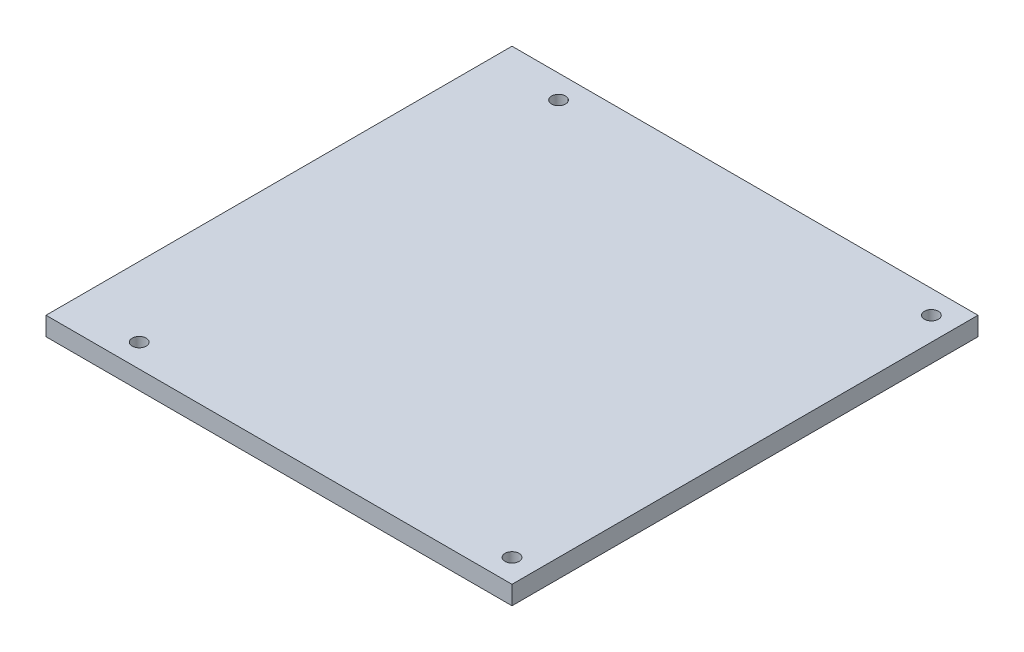
ISO-10303-21;
HEADER;
FILE_DESCRIPTION(('STEP AP214'),'2;1');
FILE_NAME('part.step','',(''),(''),'','','');
FILE_SCHEMA(('AUTOMOTIVE_DESIGN { 1 0 10303 214 1 1 1 1 }'));
ENDSEC;
DATA;
#1=APPLICATION_CONTEXT('core data for automotive mechanical design processes');
#2=APPLICATION_PROTOCOL_DEFINITION('international standard','automotive_design',2000,#1);
#3=PRODUCT_CONTEXT('',#1,'mechanical');
#4=PRODUCT('Part','Part','',(#3));
#5=PRODUCT_RELATED_PRODUCT_CATEGORY('part','',(#4));
#6=PRODUCT_DEFINITION_FORMATION('','',#4);
#7=PRODUCT_DEFINITION_CONTEXT('part definition',#1,'design');
#8=PRODUCT_DEFINITION('design','',#6,#7);
#9=PRODUCT_DEFINITION_SHAPE('','',#8);
#10=(LENGTH_UNIT() NAMED_UNIT(*) SI_UNIT(.MILLI.,.METRE.));
#11=(NAMED_UNIT(*) PLANE_ANGLE_UNIT() SI_UNIT($,.RADIAN.));
#12=(NAMED_UNIT(*) SI_UNIT($,.STERADIAN.) SOLID_ANGLE_UNIT());
#13=UNCERTAINTY_MEASURE_WITH_UNIT(LENGTH_MEASURE(1.E-05),#10,'distance_accuracy_value','');
#14=(GEOMETRIC_REPRESENTATION_CONTEXT(3) GLOBAL_UNCERTAINTY_ASSIGNED_CONTEXT((#13)) GLOBAL_UNIT_ASSIGNED_CONTEXT((#10,
#11,#12)) REPRESENTATION_CONTEXT('',''));
#15=CARTESIAN_POINT('',(0.,0.,0.));
#16=DIRECTION('',(0.,0.,1.));
#17=DIRECTION('',(1.,0.,0.));
#18=AXIS2_PLACEMENT_3D('',#15,#16,#17);
#19=CARTESIAN_POINT('',(0.,4.,0.));
#20=DIRECTION('',(1.,0.,0.));
#21=DIRECTION('',(0.,0.,-1.));
#22=AXIS2_PLACEMENT_3D('',#19,#20,#21);
#23=PLANE('',#22);
#24=DIRECTION('',(0.,0.,1.));
#25=VECTOR('',#24,1.);
#26=CARTESIAN_POINT('',(0.,0.,0.));
#27=LINE('',#26,#25);
#28=CARTESIAN_POINT('',(0.,0.,0.));
#29=VERTEX_POINT('',#28);
#30=CARTESIAN_POINT('',(0.,0.,100.));
#31=VERTEX_POINT('',#30);
#32=EDGE_CURVE('E96',#29,#31,#27,.T.);
#33=ORIENTED_EDGE('',*,*,#32,.T.);
#34=DIRECTION('',(0.,-1.,0.));
#35=VECTOR('',#34,1.);
#36=CARTESIAN_POINT('',(0.,4.,100.));
#37=LINE('',#36,#35);
#38=CARTESIAN_POINT('',(0.,4.,100.));
#39=VERTEX_POINT('',#38);
#40=EDGE_CURVE('E11',#39,#31,#37,.T.);
#41=ORIENTED_EDGE('',*,*,#40,.F.);
#42=DIRECTION('',(0.,0.,1.));
#43=VECTOR('',#42,1.);
#44=CARTESIAN_POINT('',(0.,4.,0.));
#45=LINE('',#44,#43);
#46=CARTESIAN_POINT('',(0.,4.,0.));
#47=VERTEX_POINT('',#46);
#48=EDGE_CURVE('E84',#47,#39,#45,.T.);
#49=ORIENTED_EDGE('',*,*,#48,.F.);
#50=DIRECTION('',(0.,-1.,0.));
#51=VECTOR('',#50,1.);
#52=CARTESIAN_POINT('',(0.,4.,0.));
#53=LINE('',#52,#51);
#54=EDGE_CURVE('E92',#47,#29,#53,.T.);
#55=ORIENTED_EDGE('',*,*,#54,.T.);
#56=EDGE_LOOP('',(#33,#41,#49,#55));
#57=FACE_BOUND('',#56,.T.);
#58=ADVANCED_FACE('F33',(#57),#23,.F.);
#59=CARTESIAN_POINT('',(0.,4.,100.));
#60=DIRECTION('',(0.,0.,-1.));
#61=DIRECTION('',(-1.,0.,0.));
#62=AXIS2_PLACEMENT_3D('',#59,#60,#61);
#63=PLANE('',#62);
#64=DIRECTION('',(1.,0.,0.));
#65=VECTOR('',#64,1.);
#66=CARTESIAN_POINT('',(0.,0.,100.));
#67=LINE('',#66,#65);
#68=CARTESIAN_POINT('',(100.,0.,100.));
#69=VERTEX_POINT('',#68);
#70=EDGE_CURVE('E88',#31,#69,#67,.T.);
#71=ORIENTED_EDGE('',*,*,#70,.T.);
#72=DIRECTION('',(0.,-1.,0.));
#73=VECTOR('',#72,1.);
#74=CARTESIAN_POINT('',(100.,4.,100.));
#75=LINE('',#74,#73);
#76=CARTESIAN_POINT('',(100.,4.,100.));
#77=VERTEX_POINT('',#76);
#78=EDGE_CURVE('E41',#77,#69,#75,.T.);
#79=ORIENTED_EDGE('',*,*,#78,.F.);
#80=DIRECTION('',(1.,0.,0.));
#81=VECTOR('',#80,1.);
#82=CARTESIAN_POINT('',(0.,4.,100.));
#83=LINE('',#82,#81);
#84=EDGE_CURVE('E79',#39,#77,#83,.T.);
#85=ORIENTED_EDGE('',*,*,#84,.F.);
#86=ORIENTED_EDGE('',*,*,#40,.T.);
#87=EDGE_LOOP('',(#71,#79,#85,#86));
#88=FACE_BOUND('',#87,.T.);
#89=ADVANCED_FACE('F87',(#88),#63,.F.);
#90=CARTESIAN_POINT('',(100.,4.,0.));
#91=DIRECTION('',(-1.,0.,0.));
#92=DIRECTION('',(0.,0.,1.));
#93=AXIS2_PLACEMENT_3D('',#90,#91,#92);
#94=PLANE('',#93);
#95=DIRECTION('',(0.,0.,-1.));
#96=VECTOR('',#95,1.);
#97=CARTESIAN_POINT('',(100.,0.,0.));
#98=LINE('',#97,#96);
#99=CARTESIAN_POINT('',(100.,0.,0.));
#100=VERTEX_POINT('',#99);
#101=EDGE_CURVE('E66',#69,#100,#98,.T.);
#102=ORIENTED_EDGE('',*,*,#101,.T.);
#103=DIRECTION('',(0.,-1.,0.));
#104=VECTOR('',#103,1.);
#105=CARTESIAN_POINT('',(100.,4.,0.));
#106=LINE('',#105,#104);
#107=CARTESIAN_POINT('',(100.,4.,0.));
#108=VERTEX_POINT('',#107);
#109=EDGE_CURVE('E89',#108,#100,#106,.T.);
#110=ORIENTED_EDGE('',*,*,#109,.F.);
#111=DIRECTION('',(0.,0.,-1.));
#112=VECTOR('',#111,1.);
#113=CARTESIAN_POINT('',(100.,4.,0.));
#114=LINE('',#113,#112);
#115=EDGE_CURVE('E82',#77,#108,#114,.T.);
#116=ORIENTED_EDGE('',*,*,#115,.F.);
#117=ORIENTED_EDGE('',*,*,#78,.T.);
#118=EDGE_LOOP('',(#102,#110,#116,#117));
#119=FACE_BOUND('',#118,.T.);
#120=ADVANCED_FACE('F90',(#119),#94,.F.);
#121=CARTESIAN_POINT('',(0.,4.,0.));
#122=DIRECTION('',(0.,0.,1.));
#123=DIRECTION('',(1.,0.,0.));
#124=AXIS2_PLACEMENT_3D('',#121,#122,#123);
#125=PLANE('',#124);
#126=DIRECTION('',(-1.,0.,0.));
#127=VECTOR('',#126,1.);
#128=CARTESIAN_POINT('',(0.,0.,0.));
#129=LINE('',#128,#127);
#130=EDGE_CURVE('E72',#100,#29,#129,.T.);
#131=ORIENTED_EDGE('',*,*,#130,.T.);
#132=ORIENTED_EDGE('',*,*,#54,.F.);
#133=DIRECTION('',(-1.,0.,0.));
#134=VECTOR('',#133,1.);
#135=CARTESIAN_POINT('',(0.,4.,0.));
#136=LINE('',#135,#134);
#137=EDGE_CURVE('E49',#108,#47,#136,.T.);
#138=ORIENTED_EDGE('',*,*,#137,.F.);
#139=ORIENTED_EDGE('',*,*,#109,.T.);
#140=EDGE_LOOP('',(#131,#132,#138,#139));
#141=FACE_BOUND('',#140,.T.);
#142=ADVANCED_FACE('F104',(#141),#125,.F.);
#143=CARTESIAN_POINT('',(0.,4.,0.));
#144=DIRECTION('',(0.,1.,0.));
#145=DIRECTION('',(0.,0.,1.));
#146=AXIS2_PLACEMENT_3D('',#143,#144,#145);
#147=PLANE('',#146);
#148=CARTESIAN_POINT('',(95.,4.,95.));
#149=DIRECTION('',(0.,1.,0.));
#150=DIRECTION('',(0.,0.,1.));
#151=AXIS2_PLACEMENT_3D('',#148,#149,#150);
#152=CIRCLE('',#151,1.5);
#153=CARTESIAN_POINT('',(95.,4.,96.5));
#154=VERTEX_POINT('',#153);
#155=EDGE_CURVE('E128',#154,#154,#152,.T.);
#156=ORIENTED_EDGE('',*,*,#155,.F.);
#157=EDGE_LOOP('',(#156));
#158=FACE_BOUND('',#157,.T.);
#159=CARTESIAN_POINT('',(15.,4.,95.));
#160=DIRECTION('',(0.,1.,0.));
#161=DIRECTION('',(0.,0.,1.));
#162=AXIS2_PLACEMENT_3D('',#159,#160,#161);
#163=CIRCLE('',#162,1.5);
#164=CARTESIAN_POINT('',(15.,4.,96.5));
#165=VERTEX_POINT('',#164);
#166=EDGE_CURVE('E122',#165,#165,#163,.T.);
#167=ORIENTED_EDGE('',*,*,#166,.F.);
#168=EDGE_LOOP('',(#167));
#169=FACE_BOUND('',#168,.T.);
#170=CARTESIAN_POINT('',(95.,4.,5.));
#171=DIRECTION('',(0.,1.,0.));
#172=DIRECTION('',(0.,0.,1.));
#173=AXIS2_PLACEMENT_3D('',#170,#171,#172);
#174=CIRCLE('',#173,1.5);
#175=CARTESIAN_POINT('',(95.,4.,6.5));
#176=VERTEX_POINT('',#175);
#177=EDGE_CURVE('E116',#176,#176,#174,.T.);
#178=ORIENTED_EDGE('',*,*,#177,.F.);
#179=EDGE_LOOP('',(#178));
#180=FACE_BOUND('',#179,.T.);
#181=CARTESIAN_POINT('',(15.,4.,5.));
#182=DIRECTION('',(0.,1.,0.));
#183=DIRECTION('',(0.,0.,1.));
#184=AXIS2_PLACEMENT_3D('',#181,#182,#183);
#185=CIRCLE('',#184,1.5);
#186=CARTESIAN_POINT('',(15.,4.,6.5));
#187=VERTEX_POINT('',#186);
#188=EDGE_CURVE('E110',#187,#187,#185,.T.);
#189=ORIENTED_EDGE('',*,*,#188,.F.);
#190=EDGE_LOOP('',(#189));
#191=FACE_BOUND('',#190,.T.);
#192=ORIENTED_EDGE('',*,*,#48,.T.);
#193=ORIENTED_EDGE('',*,*,#84,.T.);
#194=ORIENTED_EDGE('',*,*,#115,.T.);
#195=ORIENTED_EDGE('',*,*,#137,.T.);
#196=EDGE_LOOP('',(#192,#193,#194,#195));
#197=FACE_BOUND('',#196,.T.);
#198=ADVANCED_FACE('F80',(#158,#169,#180,#191,#197),#147,.T.);
#199=CARTESIAN_POINT('',(0.,0.,0.));
#200=DIRECTION('',(0.,1.,0.));
#201=DIRECTION('',(0.,0.,1.));
#202=AXIS2_PLACEMENT_3D('',#199,#200,#201);
#203=PLANE('',#202);
#204=CARTESIAN_POINT('',(95.,0.,95.));
#205=DIRECTION('',(0.,1.,0.));
#206=DIRECTION('',(0.,0.,1.));
#207=AXIS2_PLACEMENT_3D('',#204,#205,#206);
#208=CIRCLE('',#207,1.5);
#209=CARTESIAN_POINT('',(95.,0.,96.5));
#210=VERTEX_POINT('',#209);
#211=EDGE_CURVE('E125',#210,#210,#208,.T.);
#212=ORIENTED_EDGE('',*,*,#211,.T.);
#213=EDGE_LOOP('',(#212));
#214=FACE_BOUND('',#213,.T.);
#215=CARTESIAN_POINT('',(15.,0.,95.));
#216=DIRECTION('',(0.,1.,0.));
#217=DIRECTION('',(0.,0.,1.));
#218=AXIS2_PLACEMENT_3D('',#215,#216,#217);
#219=CIRCLE('',#218,1.5);
#220=CARTESIAN_POINT('',(15.,0.,96.5));
#221=VERTEX_POINT('',#220);
#222=EDGE_CURVE('E119',#221,#221,#219,.T.);
#223=ORIENTED_EDGE('',*,*,#222,.T.);
#224=EDGE_LOOP('',(#223));
#225=FACE_BOUND('',#224,.T.);
#226=CARTESIAN_POINT('',(95.,0.,5.));
#227=DIRECTION('',(0.,1.,0.));
#228=DIRECTION('',(0.,0.,1.));
#229=AXIS2_PLACEMENT_3D('',#226,#227,#228);
#230=CIRCLE('',#229,1.5);
#231=CARTESIAN_POINT('',(95.,0.,6.5));
#232=VERTEX_POINT('',#231);
#233=EDGE_CURVE('E113',#232,#232,#230,.T.);
#234=ORIENTED_EDGE('',*,*,#233,.T.);
#235=EDGE_LOOP('',(#234));
#236=FACE_BOUND('',#235,.T.);
#237=CARTESIAN_POINT('',(15.,0.,5.));
#238=DIRECTION('',(0.,1.,0.));
#239=DIRECTION('',(0.,0.,1.));
#240=AXIS2_PLACEMENT_3D('',#237,#238,#239);
#241=CIRCLE('',#240,1.5);
#242=CARTESIAN_POINT('',(15.,0.,6.5));
#243=VERTEX_POINT('',#242);
#244=EDGE_CURVE('E99',#243,#243,#241,.T.);
#245=ORIENTED_EDGE('',*,*,#244,.T.);
#246=EDGE_LOOP('',(#245));
#247=FACE_BOUND('',#246,.T.);
#248=ORIENTED_EDGE('',*,*,#32,.F.);
#249=ORIENTED_EDGE('',*,*,#130,.F.);
#250=ORIENTED_EDGE('',*,*,#101,.F.);
#251=ORIENTED_EDGE('',*,*,#70,.F.);
#252=EDGE_LOOP('',(#248,#249,#250,#251));
#253=FACE_BOUND('',#252,.T.);
#254=ADVANCED_FACE('F107',(#214,#225,#236,#247,#253),#203,.F.);
#255=CARTESIAN_POINT('',(15.,0.,5.));
#256=DIRECTION('',(0.,1.,0.));
#257=DIRECTION('',(0.,0.,1.));
#258=AXIS2_PLACEMENT_3D('',#255,#256,#257);
#259=CYLINDRICAL_SURFACE('',#258,1.5);
#260=ORIENTED_EDGE('',*,*,#244,.F.);
#261=EDGE_LOOP('',(#260));
#262=FACE_BOUND('',#261,.T.);
#263=ORIENTED_EDGE('',*,*,#188,.T.);
#264=EDGE_LOOP('',(#263));
#265=FACE_BOUND('',#264,.T.);
#266=ADVANCED_FACE('F152',(#262,#265),#259,.F.);
#267=CARTESIAN_POINT('',(95.,0.,5.));
#268=DIRECTION('',(0.,1.,0.));
#269=DIRECTION('',(0.,0.,1.));
#270=AXIS2_PLACEMENT_3D('',#267,#268,#269);
#271=CYLINDRICAL_SURFACE('',#270,1.5);
#272=ORIENTED_EDGE('',*,*,#233,.F.);
#273=EDGE_LOOP('',(#272));
#274=FACE_BOUND('',#273,.T.);
#275=ORIENTED_EDGE('',*,*,#177,.T.);
#276=EDGE_LOOP('',(#275));
#277=FACE_BOUND('',#276,.T.);
#278=ADVANCED_FACE('F154',(#274,#277),#271,.F.);
#279=CARTESIAN_POINT('',(15.,0.,95.));
#280=DIRECTION('',(0.,1.,0.));
#281=DIRECTION('',(0.,0.,1.));
#282=AXIS2_PLACEMENT_3D('',#279,#280,#281);
#283=CYLINDRICAL_SURFACE('',#282,1.5);
#284=ORIENTED_EDGE('',*,*,#222,.F.);
#285=EDGE_LOOP('',(#284));
#286=FACE_BOUND('',#285,.T.);
#287=ORIENTED_EDGE('',*,*,#166,.T.);
#288=EDGE_LOOP('',(#287));
#289=FACE_BOUND('',#288,.T.);
#290=ADVANCED_FACE('F139',(#286,#289),#283,.F.);
#291=CARTESIAN_POINT('',(95.,0.,95.));
#292=DIRECTION('',(0.,1.,0.));
#293=DIRECTION('',(0.,0.,1.));
#294=AXIS2_PLACEMENT_3D('',#291,#292,#293);
#295=CYLINDRICAL_SURFACE('',#294,1.5);
#296=ORIENTED_EDGE('',*,*,#211,.F.);
#297=EDGE_LOOP('',(#296));
#298=FACE_BOUND('',#297,.T.);
#299=ORIENTED_EDGE('',*,*,#155,.T.);
#300=EDGE_LOOP('',(#299));
#301=FACE_BOUND('',#300,.T.);
#302=ADVANCED_FACE('F136',(#298,#301),#295,.F.);
#303=CLOSED_SHELL('',(#58,#89,#120,#142,#198,#254,#266,#278,#290,#302));
#304=MANIFOLD_SOLID_BREP('B2',#303);
#305=ADVANCED_BREP_SHAPE_REPRESENTATION('',(#18,#304),#14);
#306=SHAPE_DEFINITION_REPRESENTATION(#9,#305);
ENDSEC;
END-ISO-10303-21;
